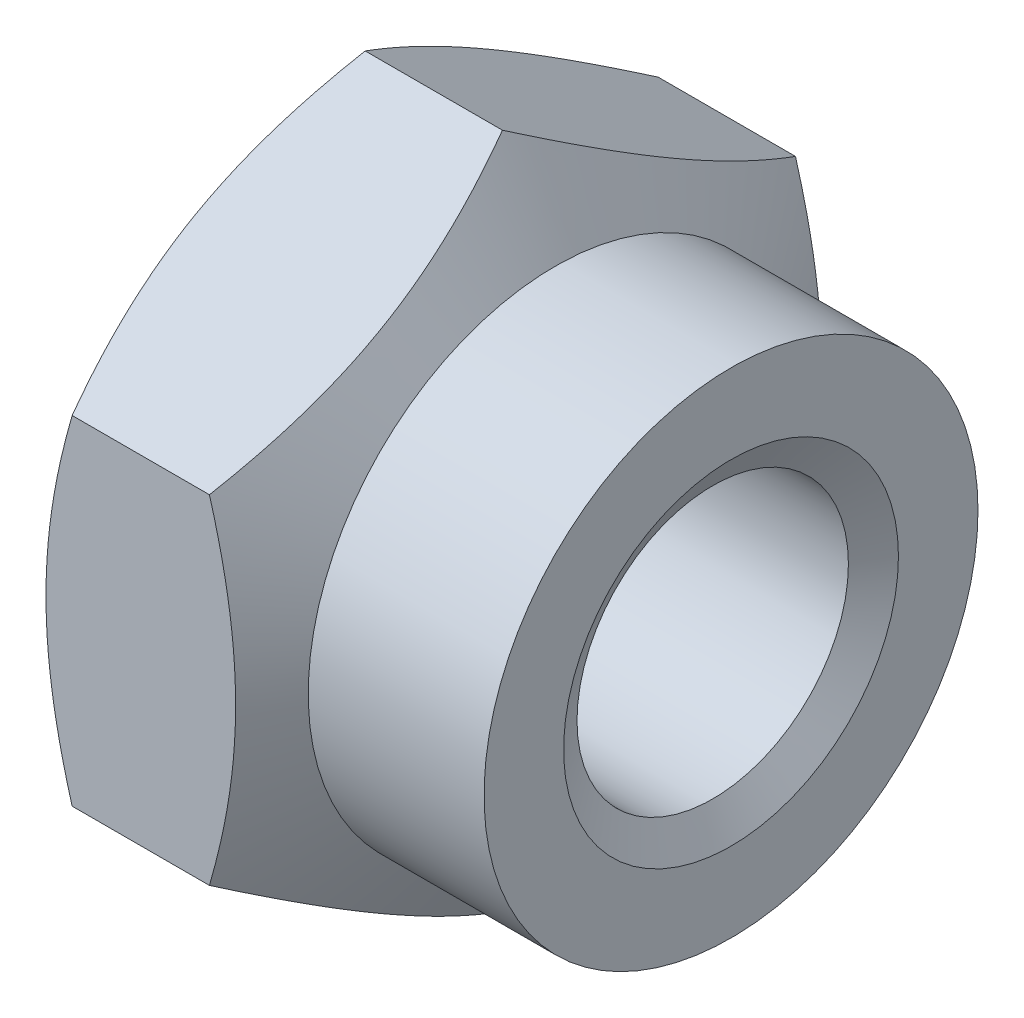
ISO-10303-21;
HEADER;
FILE_DESCRIPTION(('STEP AP214'),'2;1');
FILE_NAME('part.step','',(''),(''),'','','');
FILE_SCHEMA(('AUTOMOTIVE_DESIGN { 1 0 10303 214 1 1 1 1 }'));
ENDSEC;
DATA;
#1=APPLICATION_CONTEXT('core data for automotive mechanical design processes');
#2=APPLICATION_PROTOCOL_DEFINITION('international standard','automotive_design',2000,#1);
#3=PRODUCT_CONTEXT('',#1,'mechanical');
#4=PRODUCT('Part','Part','',(#3));
#5=PRODUCT_RELATED_PRODUCT_CATEGORY('part','',(#4));
#6=PRODUCT_DEFINITION_FORMATION('','',#4);
#7=PRODUCT_DEFINITION_CONTEXT('part definition',#1,'design');
#8=PRODUCT_DEFINITION('design','',#6,#7);
#9=PRODUCT_DEFINITION_SHAPE('','',#8);
#10=(LENGTH_UNIT() NAMED_UNIT(*) SI_UNIT(.MILLI.,.METRE.));
#11=(NAMED_UNIT(*) PLANE_ANGLE_UNIT() SI_UNIT($,.RADIAN.));
#12=(NAMED_UNIT(*) SI_UNIT($,.STERADIAN.) SOLID_ANGLE_UNIT());
#13=UNCERTAINTY_MEASURE_WITH_UNIT(LENGTH_MEASURE(1.E-05),#10,'distance_accuracy_value','');
#14=(GEOMETRIC_REPRESENTATION_CONTEXT(3) GLOBAL_UNCERTAINTY_ASSIGNED_CONTEXT((#13)) GLOBAL_UNIT_ASSIGNED_CONTEXT((#10,
#11,#12)) REPRESENTATION_CONTEXT('',''));
#15=CARTESIAN_POINT('',(0.,0.,0.));
#16=DIRECTION('',(0.,0.,1.));
#17=DIRECTION('',(1.,0.,0.));
#18=AXIS2_PLACEMENT_3D('',#15,#16,#17);
#19=CARTESIAN_POINT('',(0.,-2.02072594216369,-3.5));
#20=DIRECTION('',(0.,-0.866025403784438,-0.5));
#21=DIRECTION('',(0.,0.5,-0.866025403784438));
#22=AXIS2_PLACEMENT_3D('',#19,#20,#21);
#23=PLANE('',#22);
#24=CARTESIAN_POINT('',(0.630150014201649,-2.02072598546637,-3.49999992499622));
#25=CARTESIAN_POINT('',(0.578867220227142,-2.10952465193618,-3.346196123027));
#26=CARTESIAN_POINT('',(0.532228203362515,-2.19908982723308,-3.19106468882431));
#27=CARTESIAN_POINT('',(0.450821200915491,-2.37977093886553,-2.87811582350915));
#28=CARTESIAN_POINT('',(0.416082010900104,-2.47089008450928,-2.7202928337118));
#29=CARTESIAN_POINT('',(0.362007958096548,-2.65199918192389,-2.4066026752767));
#30=CARTESIAN_POINT('',(0.342313160538677,-2.74196127554762,-2.25078375836515));
#31=CARTESIAN_POINT('',(0.318806080923748,-2.92230854323823,-1.9384131277188));
#32=CARTESIAN_POINT('',(0.314974328300394,-3.01269306224179,-1.78186254858696));
#33=CARTESIAN_POINT('',(0.322966050013783,-3.18156683407466,-1.48936459570663));
#34=CARTESIAN_POINT('',(0.33282729178681,-3.26008142781289,-1.35337333021638));
#35=CARTESIAN_POINT('',(0.364075317786994,-3.41659911833186,-1.0822767379542));
#36=CARTESIAN_POINT('',(0.385472765827316,-3.49460167416391,-0.947172348132856));
#37=CARTESIAN_POINT('',(0.43896224349233,-3.65144180578213,-0.67551727150431));
#38=CARTESIAN_POINT('',(0.471280905686307,-3.73025954135081,-0.539000948961814));
#39=CARTESIAN_POINT('',(0.54463060530994,-3.88671978608905,-0.268003855710532));
#40=CARTESIAN_POINT('',(0.585644419546534,-3.96436429814832,-0.133519615894977));
#41=CARTESIAN_POINT('',(0.630150014199006,-4.04145184102031,-7.50100528599814E-08));
#42=B_SPLINE_CURVE_WITH_KNOTS('',3,(#24,#25,#26,#27,#28,#29,#30,#31,#32,#33,#34,#35,#36,#37,#38,
#39,#40,#41),.UNSPECIFIED.,.F.,.F.,(4,2,2,2,2,2,2,2,4),(0.,0.554778014293772,1.11088916777355,
1.65323829337992,2.19492153288442,2.66648855859081,3.13849223965251,3.62096269935922,
4.10248627343419),.UNSPECIFIED.);
#43=CARTESIAN_POINT('',(0.630150044012355,-2.02072595882601,-3.5));
#44=VERTEX_POINT('',#43);
#45=CARTESIAN_POINT('',(0.630150026700639,-4.04145186267377,-3.7505153091958E-08));
#46=VERTEX_POINT('',#45);
#47=EDGE_CURVE('E249',#44,#46,#42,.T.);
#48=ORIENTED_EDGE('',*,*,#47,.F.);
#49=DIRECTION('',(1.,0.,0.));
#50=VECTOR('',#49,1.);
#51=CARTESIAN_POINT('',(0.,-2.02072594216369,-3.5));
#52=LINE('',#51,#50);
#53=CARTESIAN_POINT('',(2.26984997330317,-2.02072596380483,-3.49999996251644));
#54=VERTEX_POINT('',#53);
#55=EDGE_CURVE('E96',#54,#44,#52,.F.);
#56=ORIENTED_EDGE('',*,*,#55,.F.);
#57=CARTESIAN_POINT('',(2.26984995118854,-4.04145190098989,2.88603183590748E-08));
#58=CARTESIAN_POINT('',(2.32113274799531,-3.95265323352798,-0.153803774828139));
#59=CARTESIAN_POINT('',(2.36777176787103,-3.86308805723251,-0.308935210760751));
#60=CARTESIAN_POINT('',(2.44917877657305,-3.6824069435057,-0.62188407970371));
#61=CARTESIAN_POINT('',(2.48391796982875,-3.59128779676555,-0.779707071399984));
#62=CARTESIAN_POINT('',(2.53799202905945,-3.41017869716019,-1.09339723362952));
#63=CARTESIAN_POINT('',(2.55768682981688,-3.32021660244603,-1.24921615242977));
#64=CARTESIAN_POINT('',(2.58119391560829,-3.13986933244696,-1.56158678707449));
#65=CARTESIAN_POINT('',(2.58502567121085,-3.04948481222562,-1.7181373683156));
#66=CARTESIAN_POINT('',(2.57703395444406,-2.88061103529859,-2.01063533001927));
#67=CARTESIAN_POINT('',(2.56717271428084,-2.80209643770439,-2.14662660218824));
#68=CARTESIAN_POINT('',(2.5359246902104,-2.64557873946101,-2.4177232078295));
#69=CARTESIAN_POINT('',(2.51452724248719,-2.5675761797606,-2.55282760435104));
#70=CARTESIAN_POINT('',(2.46103776426699,-2.41073604026809,-2.82448269461826));
#71=CARTESIAN_POINT('',(2.4287191011591,-2.33191830069638,-2.96099902409419));
#72=CARTESIAN_POINT('',(2.35536939875617,-2.17545804807543,-3.23199613099874));
#73=CARTESIAN_POINT('',(2.31435558265801,-2.09781353213604,-3.36648037753486));
#74=CARTESIAN_POINT('',(2.26984998579716,-2.02072598544507,-3.49999992503446));
#75=B_SPLINE_CURVE_WITH_KNOTS('',3,(#57,#58,#59,#60,#61,#62,#63,#64,#65,#66,#67,#68,#69,#70,#71,
#72,#73,#74),.UNSPECIFIED.,.F.,.F.,(4,2,2,2,2,2,2,2,4),(0.,0.554778022383838,1.11088918416299,
1.65323831731949,2.19492156429581,2.66648861271116,3.1384923165695,3.62096280030852,
4.10248639826226),.UNSPECIFIED.);
#76=CARTESIAN_POINT('',(2.26984997330875,-4.04145186267656,3.75003131262279E-08));
#77=VERTEX_POINT('',#76);
#78=EDGE_CURVE('E92',#77,#54,#75,.T.);
#79=ORIENTED_EDGE('',*,*,#78,.F.);
#80=DIRECTION('',(1.,0.,0.));
#81=VECTOR('',#80,1.);
#82=CARTESIAN_POINT('',(0.,-4.04145188432738,0.));
#83=LINE('',#82,#81);
#84=EDGE_CURVE('E80',#46,#77,#83,.T.);
#85=ORIENTED_EDGE('',*,*,#84,.F.);
#86=EDGE_LOOP('',(#48,#56,#79,#85));
#87=FACE_BOUND('',#86,.T.);
#88=ADVANCED_FACE('F17',(#87),#23,.T.);
#89=CARTESIAN_POINT('',(0.,-4.04145188432738,0.));
#90=DIRECTION('',(0.,-0.866025403784439,0.5));
#91=DIRECTION('',(0.,-0.5,-0.866025403784439));
#92=AXIS2_PLACEMENT_3D('',#89,#90,#91);
#93=PLANE('',#92);
#94=CARTESIAN_POINT('',(0.630150048824673,-4.04145190099372,-2.88669495236416E-08));
#95=CARTESIAN_POINT('',(0.578867252017729,-3.95265323353174,0.153803774821607));
#96=CARTESIAN_POINT('',(0.532228232141822,-3.86308805723622,0.308935210754318));
#97=CARTESIAN_POINT('',(0.450821223439403,-3.68240694350929,0.621884079697485));
#98=CARTESIAN_POINT('',(0.416082030183497,-3.59128779676908,0.779707071393866));
#99=CARTESIAN_POINT('',(0.362007970952379,-3.41017869716358,1.09339723362364));
#100=CARTESIAN_POINT('',(0.342313170194742,-3.32021660244934,1.24921615242402));
#101=CARTESIAN_POINT('',(0.318806084402937,-3.13986933245012,1.56158678706903));
#102=CARTESIAN_POINT('',(0.314974328800188,-3.04948481222869,1.71813736831028));
#103=CARTESIAN_POINT('',(0.32296604556658,-2.88061103530297,2.01063533001167));
#104=CARTESIAN_POINT('',(0.332827285729363,-2.80209643771017,2.14662660217822));
#105=CARTESIAN_POINT('',(0.364075309798546,-2.64557873946957,2.41772320781468));
#106=CARTESIAN_POINT('',(0.385472757520932,-2.56757617977053,2.55282760433385));
#107=CARTESIAN_POINT('',(0.438962235739174,-2.41073604028079,2.82448269459626));
#108=CARTESIAN_POINT('',(0.471280898845909,-2.33191830071048,2.96099902406977));
#109=CARTESIAN_POINT('',(0.54463060124633,-2.17545804809227,3.23199613096957));
#110=CARTESIAN_POINT('',(0.585644417343135,-2.09781353215423,3.36648037750335));
#111=CARTESIAN_POINT('',(0.630150014202574,-2.02072598546458,3.49999992500065));
#112=B_SPLINE_CURVE_WITH_KNOTS('',3,(#94,#95,#96,#97,#98,#99,#100,#101,#102,#103,#104,#105,#106,
#107,#108,#109,#110,#111),.UNSPECIFIED.,.F.,.F.,(4,2,2,2,2,2,2,2,4),(0.,0.554778022384315,
1.11088918416395,1.65323831732097,2.19492156429781,2.66648861270473,3.1384923165546,
3.62096280028471,4.10248639822961),.UNSPECIFIED.);
#113=CARTESIAN_POINT('',(0.630150026702465,-2.02072596381414,3.49999996250033));
#114=VERTEX_POINT('',#113);
#115=EDGE_CURVE('E83',#46,#114,#112,.T.);
#116=ORIENTED_EDGE('',*,*,#115,.F.);
#117=ORIENTED_EDGE('',*,*,#84,.T.);
#118=CARTESIAN_POINT('',(2.2698499858071,-2.02072598546323,3.4999999249959));
#119=CARTESIAN_POINT('',(2.32113277978282,-2.1095246519346,3.34619612302768));
#120=CARTESIAN_POINT('',(2.36777179664799,-2.19908982723219,3.19106468882531));
#121=CARTESIAN_POINT('',(2.44917879909549,-2.37977093886526,2.87811582351016));
#122=CARTESIAN_POINT('',(2.48391798911081,-2.47089008450895,2.72029283371253));
#123=CARTESIAN_POINT('',(2.53799204191436,-2.65199918192361,2.40660267527704));
#124=CARTESIAN_POINT('',(2.55768683947229,-2.74196127554746,2.25078375836539));
#125=CARTESIAN_POINT('',(2.58119391908727,-2.92230854323825,1.9384131277188));
#126=CARTESIAN_POINT('',(2.58502567171062,-3.01269306224188,1.78186254858682));
#127=CARTESIAN_POINT('',(2.57703394999718,-3.18156683407523,1.48936459570562));
#128=CARTESIAN_POINT('',(2.56717270822407,-3.26008142781389,1.35337333021466));
#129=CARTESIAN_POINT('',(2.53592468222358,-3.41659911833367,1.08227673795106));
#130=CARTESIAN_POINT('',(2.51452723418305,-3.49460167416613,0.947172348129011));
#131=CARTESIAN_POINT('',(2.46103775651751,-3.65144180578518,0.675517271499026));
#132=CARTESIAN_POINT('',(2.42871909432322,-3.73025954135429,0.539000948955796));
#133=CARTESIAN_POINT('',(2.35536939469889,-3.88671978609336,0.268003855703067));
#134=CARTESIAN_POINT('',(2.31435558046192,-3.96436429815304,0.133519615886799));
#135=CARTESIAN_POINT('',(2.26984998580904,-4.04145184102543,7.50011723129684E-08));
#136=B_SPLINE_CURVE_WITH_KNOTS('',3,(#118,#119,#120,#121,#122,#123,#124,#125,#126,#127,#128,
#129,#130,#131,#132,#133,#134,#135),.UNSPECIFIED.,.F.,.F.,(4,2,2,2,2,2,2,2,4),(0.,
0.554778014294406,1.11088916777477,1.65323829338158,2.19492153288656,2.66648855859544,
3.13849223965963,3.62096269936902,4.10248627344667),.UNSPECIFIED.);
#137=CARTESIAN_POINT('',(2.2698499559984,-2.02072595882687,3.5));
#138=VERTEX_POINT('',#137);
#139=EDGE_CURVE('E21',#138,#77,#136,.T.);
#140=ORIENTED_EDGE('',*,*,#139,.F.);
#141=DIRECTION('',(1.,0.,0.));
#142=VECTOR('',#141,1.);
#143=CARTESIAN_POINT('',(0.,-2.02072594216369,3.5));
#144=LINE('',#143,#142);
#145=EDGE_CURVE('E73',#114,#138,#144,.T.);
#146=ORIENTED_EDGE('',*,*,#145,.F.);
#147=EDGE_LOOP('',(#116,#117,#140,#146));
#148=FACE_BOUND('',#147,.T.);
#149=ADVANCED_FACE('F82',(#148),#93,.T.);
#150=CARTESIAN_POINT('',(0.,-2.02072594216369,3.5));
#151=DIRECTION('',(0.,0.,1.));
#152=DIRECTION('',(0.,-1.,0.));
#153=AXIS2_PLACEMENT_3D('',#150,#151,#152);
#154=PLANE('',#153);
#155=CARTESIAN_POINT('',(0.63015004882102,-2.02072597548372,3.5));
#156=CARTESIAN_POINT('',(0.578867252014371,-1.84312864055996,3.5));
#157=CARTESIAN_POINT('',(0.532228232138778,-1.66399828796911,3.5));
#158=CARTESIAN_POINT('',(0.450821223437014,-1.30263606051566,3.5));
#159=CARTESIAN_POINT('',(0.416082030181448,-1.12039776703544,3.5));
#160=CARTESIAN_POINT('',(0.362007970951013,-0.758179567824902,3.5));
#161=CARTESIAN_POINT('',(0.342313170193717,-0.578255378396678,3.5));
#162=CARTESIAN_POINT('',(0.318806084402569,-0.217560838398744,3.5));
#163=CARTESIAN_POINT('',(0.314974328800135,-0.03679179795616,3.5));
#164=CARTESIAN_POINT('',(0.322966045567141,0.300955755898064,3.5));
#165=CARTESIAN_POINT('',(0.332827285730491,0.45798495108673,3.5));
#166=CARTESIAN_POINT('',(0.364075309801218,0.771020347574003,3.5));
#167=CARTESIAN_POINT('',(0.385472757524582,0.927025466975086,3.5));
#168=CARTESIAN_POINT('',(0.438962235745121,1.24070574596062,3.5));
#169=CARTESIAN_POINT('',(0.471280898853187,1.39834122510429,3.5));
#170=CARTESIAN_POINT('',(0.544630601256481,1.71126173034671,3.5));
#171=CARTESIAN_POINT('',(0.585644417354826,1.86655076222574,3.5));
#172=CARTESIAN_POINT('',(0.630150014215858,2.02072585560792,3.5));
#173=B_SPLINE_CURVE_WITH_KNOTS('',3,(#155,#156,#157,#158,#159,#160,#161,#162,#163,#164,#165,
#166,#167,#168,#169,#170,#171,#172),.UNSPECIFIED.,.F.,.F.,(4,2,2,2,2,2,2,2,4),(0.,
0.554778022383508,1.11088918416232,1.6532383173185,2.1949215642945,2.66648861271067,
3.13849231656984,3.62096280030973,4.10248639826432),.UNSPECIFIED.);
#174=CARTESIAN_POINT('',(0.630150026708842,2.02072589888489,3.5));
#175=VERTEX_POINT('',#174);
#176=EDGE_CURVE('E163',#114,#175,#173,.T.);
#177=ORIENTED_EDGE('',*,*,#176,.F.);
#178=ORIENTED_EDGE('',*,*,#145,.T.);
#179=CARTESIAN_POINT('',(2.26984995118682,2.02072597549467,3.5));
#180=CARTESIAN_POINT('',(2.32113274800484,1.84312864053177,3.5));
#181=CARTESIAN_POINT('',(2.36777176788994,1.6639982879013,3.5));
#182=CARTESIAN_POINT('',(2.44917877660607,1.30263606036243,3.5));
#183=CARTESIAN_POINT('',(2.48391796986615,1.12039776683632,3.5));
#184=CARTESIAN_POINT('',(2.53799202908412,0.758179567618496,3.5));
#185=CARTESIAN_POINT('',(2.55768682983131,0.578255378229937,3.5));
#186=CARTESIAN_POINT('',(2.58119391561052,0.217560838318533,3.5));
#187=CARTESIAN_POINT('',(2.58502567121146,0.0367917979228319,3.5));
#188=CARTESIAN_POINT('',(2.57703395420329,-0.300955766014669,3.5));
#189=CARTESIAN_POINT('',(2.56717271300591,-0.457984971311765,3.5));
#190=CARTESIAN_POINT('',(2.53592468544421,-0.771020387847949,3.5));
#191=CARTESIAN_POINT('',(2.51452723526053,-0.927025517189113,3.5));
#192=CARTESIAN_POINT('',(2.46103775090524,-1.2407058162849,3.5));
#193=CARTESIAN_POINT('',(2.42871908407828,-1.39834130558888,3.5));
#194=CARTESIAN_POINT('',(2.35536937342834,-1.71126183078223,3.5));
#195=CARTESIAN_POINT('',(2.31435555280717,-1.86655087245322,3.5));
#196=CARTESIAN_POINT('',(2.26984995118815,-2.02072597549006,3.5));
#197=B_SPLINE_CURVE_WITH_KNOTS('',3,(#179,#180,#181,#182,#183,#184,#185,#186,#187,#188,#189,
#190,#191,#192,#193,#194,#195,#196),.UNSPECIFIED.,.F.,.F.,(4,2,2,2,2,2,2,2,4),(0.,
0.55477802250554,1.11088918442198,1.65323831745545,2.19492156429743,2.66648864308187,
3.13849237742165,3.62096289322499,4.10248652299892),.UNSPECIFIED.);
#198=CARTESIAN_POINT('',(2.26984997330961,2.02072596381599,3.49999996249711));
#199=VERTEX_POINT('',#198);
#200=EDGE_CURVE('E94',#199,#138,#197,.T.);
#201=ORIENTED_EDGE('',*,*,#200,.F.);
#202=DIRECTION('',(1.,0.,0.));
#203=VECTOR('',#202,1.);
#204=CARTESIAN_POINT('',(0.,2.02072594216369,3.5));
#205=LINE('',#204,#203);
#206=EDGE_CURVE('E232',#175,#199,#205,.T.);
#207=ORIENTED_EDGE('',*,*,#206,.F.);
#208=EDGE_LOOP('',(#177,#178,#201,#207));
#209=FACE_BOUND('',#208,.T.);
#210=ADVANCED_FACE('F171',(#209),#154,.T.);
#211=CARTESIAN_POINT('',(0.,2.02072594216369,3.5));
#212=DIRECTION('',(0.,0.866025403784439,0.5));
#213=DIRECTION('',(0.,-0.5,0.866025403784439));
#214=AXIS2_PLACEMENT_3D('',#211,#212,#213);
#215=PLANE('',#214);
#216=CARTESIAN_POINT('',(0.630150048823882,2.02072592549872,3.50000002886458));
#217=CARTESIAN_POINT('',(0.578867252016999,2.10952459296068,3.34619622517605));
#218=CARTESIAN_POINT('',(0.532228232141157,2.19908976925619,3.19106478924336));
#219=CARTESIAN_POINT('',(0.450821223438875,2.37977088298308,2.87811592030025));
#220=CARTESIAN_POINT('',(0.416082030183042,2.47089002972329,2.7202929286039));
#221=CARTESIAN_POINT('',(0.362007970952075,2.65199912932874,2.4066027663742));
#222=CARTESIAN_POINT('',(0.342313170194515,2.74196122404294,2.25078384757388));
#223=CARTESIAN_POINT('',(0.318806084402857,2.9223084940421,1.938413212929));
#224=CARTESIAN_POINT('',(0.314974328800176,3.01269301426349,1.78186263168781));
#225=CARTESIAN_POINT('',(0.322966045566777,3.18156679119109,1.48936466998316));
#226=CARTESIAN_POINT('',(0.332827285730006,3.2600813887858,1.35337339781329));
#227=CARTESIAN_POINT('',(0.364075309800618,3.4165990870302,1.08227679217025));
#228=CARTESIAN_POINT('',(0.385472757523987,3.49460164673113,0.947172395647822));
#229=CARTESIAN_POINT('',(0.438962235744649,3.65144178622467,0.675517305378809));
#230=CARTESIAN_POINT('',(0.471280898852838,3.7302595257969,0.539000975901973));
#231=CARTESIAN_POINT('',(0.544630601256465,3.88671977841889,0.268003868995635));
#232=CARTESIAN_POINT('',(0.585644417355021,3.96436429435879,0.133519622458641));
#233=CARTESIAN_POINT('',(0.630150014216296,4.04145184105025,7.49581789627771E-08));
#234=B_SPLINE_CURVE_WITH_KNOTS('',3,(#216,#217,#218,#219,#220,#221,#222,#223,#224,#225,#226,
#227,#228,#229,#230,#231,#232,#233),.UNSPECIFIED.,.F.,.F.,(4,2,2,2,2,2,2,2,4),(0.,
0.554778022384179,1.11088918416368,1.65323831732048,2.1949215642971,2.66648861271553,
3.13849231657697,3.62096280031925,4.10248639827622),.UNSPECIFIED.);
#235=CARTESIAN_POINT('',(0.630150026709073,4.04145186268838,3.7479850701366E-08));
#236=VERTEX_POINT('',#235);
#237=EDGE_CURVE('E154',#175,#236,#234,.T.);
#238=ORIENTED_EDGE('',*,*,#237,.F.);
#239=ORIENTED_EDGE('',*,*,#206,.T.);
#240=CARTESIAN_POINT('',(2.26984995118295,4.04145190099957,-2.88770871665031E-08));
#241=CARTESIAN_POINT('',(2.32113274799017,3.9526532335375,0.153803774811635));
#242=CARTESIAN_POINT('',(2.36777176786637,3.86308805724188,0.308935210744513));
#243=CARTESIAN_POINT('',(2.4491787765694,3.68240694351475,0.621884079688029));
#244=CARTESIAN_POINT('',(2.48391796982562,3.59128779677443,0.779707071384593));
#245=CARTESIAN_POINT('',(2.53799202905737,3.41017869716872,1.09339723361474));
#246=CARTESIAN_POINT('',(2.55768682981532,3.32021660245437,1.24921615241531));
#247=CARTESIAN_POINT('',(2.58119391560773,3.13986933245492,1.5615867870607));
#248=CARTESIAN_POINT('',(2.58502567121077,3.04948481223337,1.71813736830217));
#249=CARTESIAN_POINT('',(2.57703395444488,2.88061103530748,2.01063533000385));
#250=CARTESIAN_POINT('',(2.56717271428232,2.80209643771464,2.14662660217049));
#251=CARTESIAN_POINT('',(2.53592469021355,2.64557873947393,2.41772320780713));
#252=CARTESIAN_POINT('',(2.51452724249135,2.56757617977483,2.55282760432639));
#253=CARTESIAN_POINT('',(2.46103776427345,2.41073604028497,2.82448269458901));
#254=CARTESIAN_POINT('',(2.42871910116687,2.33191830071461,2.96099902406262));
#255=CARTESIAN_POINT('',(2.35536939876671,2.17545804809627,3.23199613096264));
#256=CARTESIAN_POINT('',(2.31435558267002,2.09781353215817,3.36648037749653));
#257=CARTESIAN_POINT('',(2.26984998581067,2.02072598546847,3.49999992499393));
#258=B_SPLINE_CURVE_WITH_KNOTS('',3,(#240,#241,#242,#243,#244,#245,#246,#247,#248,#249,#250,
#251,#252,#253,#254,#255,#256,#257),.UNSPECIFIED.,.F.,.F.,(4,2,2,2,2,2,2,2,4),(0.,
0.554778022385097,1.11088918416554,1.6532383173233,2.19492156430088,2.66648861270804,
3.13849231655816,3.62096280028854,4.10248639823371),.UNSPECIFIED.);
#259=CARTESIAN_POINT('',(2.26984997330374,4.04145186268525,-3.748527405546E-08));
#260=VERTEX_POINT('',#259);
#261=EDGE_CURVE('E131',#260,#199,#258,.T.);
#262=ORIENTED_EDGE('',*,*,#261,.F.);
#263=DIRECTION('',(1.,0.,0.));
#264=VECTOR('',#263,1.);
#265=CARTESIAN_POINT('',(0.,4.04145188432738,0.));
#266=LINE('',#265,#264);
#267=EDGE_CURVE('E234',#236,#260,#266,.T.);
#268=ORIENTED_EDGE('',*,*,#267,.F.);
#269=EDGE_LOOP('',(#238,#239,#262,#268));
#270=FACE_BOUND('',#269,.T.);
#271=ADVANCED_FACE('F143',(#270),#215,.T.);
#272=CARTESIAN_POINT('',(0.,4.04145188432738,0.));
#273=DIRECTION('',(0.,0.866025403784439,-0.5));
#274=DIRECTION('',(0.,0.5,0.866025403784439));
#275=AXIS2_PLACEMENT_3D('',#272,#273,#274);
#276=PLANE('',#275);
#277=CARTESIAN_POINT('',(0.630150048823421,4.04145190099155,2.88631926491844E-08));
#278=CARTESIAN_POINT('',(0.578867252016577,3.95265323352961,-0.15380377482531));
#279=CARTESIAN_POINT('',(0.532228232140777,3.86308805723412,-0.308935210757967));
#280=CARTESIAN_POINT('',(0.450821223438581,3.68240694350726,-0.621884079701019));
#281=CARTESIAN_POINT('',(0.416082030182791,3.59128779676707,-0.77970707139734));
#282=CARTESIAN_POINT('',(0.362007970951908,3.41017869716165,-1.09339723362698));
#283=CARTESIAN_POINT('',(0.342313170194389,3.32021660244746,-1.24921615242728));
#284=CARTESIAN_POINT('',(0.318806084402811,3.13986933244833,-1.56158678707213));
#285=CARTESIAN_POINT('',(0.31497432880017,3.04948481222695,-1.71813736831329));
#286=CARTESIAN_POINT('',(0.322966045566796,2.88061103530026,-2.01063533001636));
#287=CARTESIAN_POINT('',(0.332827285729874,2.80209643770645,-2.14662660218467));
#288=CARTESIAN_POINT('',(0.364075309799926,2.64557873946383,-2.41772320782462));
#289=CARTESIAN_POINT('',(0.385472757522885,2.56757617976379,-2.55282760434551));
#290=CARTESIAN_POINT('',(0.43896223574251,2.41073604027204,-2.82448269461142));
#291=CARTESIAN_POINT('',(0.471280898850062,2.33191830070072,-2.96099902408668));
#292=CARTESIAN_POINT('',(0.544630601252268,2.17545804808051,-3.23199613098994));
#293=CARTESIAN_POINT('',(0.58564441735004,2.09781353214149,-3.36648037752542));
#294=CARTESIAN_POINT('',(0.630150014210487,2.02072598545088,-3.49999992502439));
#295=B_SPLINE_CURVE_WITH_KNOTS('',3,(#277,#278,#279,#280,#281,#282,#283,#284,#285,#286,#287,
#288,#289,#290,#291,#292,#293,#294),.UNSPECIFIED.,.F.,.F.,(4,2,2,2,2,2,2,2,4),(0.,
0.554778022384051,1.11088918416342,1.65323831732014,2.19492156429668,2.66648861270971,
3.13849231656573,3.6209628003023,4.10248639825361),.UNSPECIFIED.);
#296=CARTESIAN_POINT('',(0.630150026706016,2.02072596380799,-3.49999996251098));
#297=VERTEX_POINT('',#296);
#298=EDGE_CURVE('E40',#236,#297,#295,.T.);
#299=ORIENTED_EDGE('',*,*,#298,.F.);
#300=ORIENTED_EDGE('',*,*,#267,.T.);
#301=CARTESIAN_POINT('',(2.26984995118868,2.02072592550142,-3.5000000288599));
#302=CARTESIAN_POINT('',(2.32113274799544,2.10952459296333,-3.34619622517145));
#303=CARTESIAN_POINT('',(2.36777176787114,2.1990897692588,-3.19106478923885));
#304=CARTESIAN_POINT('',(2.44917877657314,2.37977088298559,-2.87811592029591));
#305=CARTESIAN_POINT('',(2.48391796982883,2.47089002972574,-2.72029292859964));
#306=CARTESIAN_POINT('',(2.53799202905951,2.6519991293311,-2.40660276637012));
#307=CARTESIAN_POINT('',(2.55768682981692,2.74196122404525,-2.25078384756988));
#308=CARTESIAN_POINT('',(2.5811939156083,2.92230849404431,-1.93841321292517));
#309=CARTESIAN_POINT('',(2.58502567121085,3.01269301426565,-1.78186263168407));
#310=CARTESIAN_POINT('',(2.57703395444405,3.1815667911925,-1.48936466998071));
#311=CARTESIAN_POINT('',(2.56717271428086,3.26008138878652,-1.35337339781203));
#312=CARTESIAN_POINT('',(2.53592469021051,3.41659908702955,-1.08227679217137));
#313=CARTESIAN_POINT('',(2.51452724248738,3.49460164672979,-0.947172395650132));
#314=CARTESIAN_POINT('',(2.46103776426737,3.65144178622196,-0.675517305383515));
#315=CARTESIAN_POINT('',(2.42871910115961,3.73025952579349,-0.539000975907891));
#316=CARTESIAN_POINT('',(2.35536939875695,3.8867197784141,-0.268003869003935));
#317=CARTESIAN_POINT('',(2.31435558265894,3.96436429435332,-0.133519622468111));
#318=CARTESIAN_POINT('',(2.26984998579825,4.04145184104412,-7.49688032522905E-08));
#319=B_SPLINE_CURVE_WITH_KNOTS('',3,(#301,#302,#303,#304,#305,#306,#307,#308,#309,#310,#311,
#312,#313,#314,#315,#316,#317,#318),.UNSPECIFIED.,.F.,.F.,(4,2,2,2,2,2,2,2,4),(0.,
0.554778022383802,1.11088918416292,1.65323831731939,2.19492156429568,2.66648861270999,
3.13849231656728,3.6209628003052,4.10248639825784),.UNSPECIFIED.);
#320=CARTESIAN_POINT('',(2.26984997330478,2.02072589887582,-3.5));
#321=VERTEX_POINT('',#320);
#322=EDGE_CURVE('E99',#321,#260,#319,.T.);
#323=ORIENTED_EDGE('',*,*,#322,.F.);
#324=DIRECTION('',(1.,0.,0.));
#325=VECTOR('',#324,1.);
#326=CARTESIAN_POINT('',(0.,2.02072594216369,-3.5));
#327=LINE('',#326,#325);
#328=EDGE_CURVE('E95',#297,#321,#327,.T.);
#329=ORIENTED_EDGE('',*,*,#328,.F.);
#330=EDGE_LOOP('',(#299,#300,#323,#329));
#331=FACE_BOUND('',#330,.T.);
#332=ADVANCED_FACE('F140',(#331),#276,.T.);
#333=CARTESIAN_POINT('',(0.,2.02072594216369,-3.5));
#334=DIRECTION('',(0.,0.,-1.));
#335=DIRECTION('',(0.,1.,0.));
#336=AXIS2_PLACEMENT_3D('',#333,#334,#335);
#337=PLANE('',#336);
#338=CARTESIAN_POINT('',(0.630150048829535,2.02072597551322,-3.5));
#339=CARTESIAN_POINT('',(0.578867252011084,1.84312864055002,-3.5));
#340=CARTESIAN_POINT('',(0.532228232125513,1.66399828791924,-3.5));
#341=CARTESIAN_POINT('',(0.450821223408416,1.30263606037971,-3.5));
#342=CARTESIAN_POINT('',(0.416082030147842,1.12039776685327,-3.5));
#343=CARTESIAN_POINT('',(0.362007970928869,0.758179567634768,-3.5));
#344=CARTESIAN_POINT('',(0.342313170181191,0.578255378245871,-3.5));
#345=CARTESIAN_POINT('',(0.318806084401022,0.217560838333751,-3.5));
#346=CARTESIAN_POINT('',(0.314974328799624,0.0367917979376728,-3.5));
#347=CARTESIAN_POINT('',(0.322966045807026,-0.300955766001257,-3.5));
#348=CARTESIAN_POINT('',(0.332827287004145,-0.457984971299401,-3.5));
#349=CARTESIAN_POINT('',(0.364075314565494,-0.771020387837684,-3.5));
#350=CARTESIAN_POINT('',(0.385472764749082,-0.927025517179901,-3.5));
#351=CARTESIAN_POINT('',(0.438962249104377,-1.24070581627784,-3.5));
#352=CARTESIAN_POINT('',(0.47128091593142,-1.3983413055829,-3.5));
#353=CARTESIAN_POINT('',(0.544630626581668,-1.7112618307784,-3.5));
#354=CARTESIAN_POINT('',(0.585644447203069,-1.86655087245045,-3.5));
#355=CARTESIAN_POINT('',(0.630150048822352,-2.02072597548833,-3.5));
#356=B_SPLINE_CURVE_WITH_KNOTS('',3,(#338,#339,#340,#341,#342,#343,#344,#345,#346,#347,#348,
#349,#350,#351,#352,#353,#354,#355),.UNSPECIFIED.,.F.,.F.,(4,2,2,2,2,2,2,2,4),(0.,
0.554778022506789,1.11088918442451,1.65323831745915,2.19492156430229,2.6664886430898,
3.13849237743266,3.62096289323926,4.10248652301642),.UNSPECIFIED.);
#357=EDGE_CURVE('E153',#297,#44,#356,.T.);
#358=ORIENTED_EDGE('',*,*,#357,.F.);
#359=ORIENTED_EDGE('',*,*,#328,.T.);
#360=CARTESIAN_POINT('',(2.2698499511841,-2.02072597550412,-3.5));
#361=CARTESIAN_POINT('',(2.32113274799123,-1.84312864058003,-3.5));
#362=CARTESIAN_POINT('',(2.36777176786733,-1.66399828798884,-3.5));
#363=CARTESIAN_POINT('',(2.44917877657015,-1.3026360605347,-3.5));
#364=CARTESIAN_POINT('',(2.48391796982627,-1.12039776705411,-3.5));
#365=CARTESIAN_POINT('',(2.5379920290578,-0.758179567842828,-3.5));
#366=CARTESIAN_POINT('',(2.55768682981564,-0.578255378414226,-3.5));
#367=CARTESIAN_POINT('',(2.58119391560784,-0.217560838415492,-3.5));
#368=CARTESIAN_POINT('',(2.58502567121078,-0.0367917979724864,-3.5));
#369=CARTESIAN_POINT('',(2.57703395444466,0.300955755881807,-3.5));
#370=CARTESIAN_POINT('',(2.56717271428175,0.457984951070116,-3.5));
#371=CARTESIAN_POINT('',(2.53592469021193,0.771020347556707,-3.5));
#372=CARTESIAN_POINT('',(2.51452724248903,0.927025466957466,-3.5));
#373=CARTESIAN_POINT('',(2.46103776426941,1.24070574594236,-3.5));
#374=CARTESIAN_POINT('',(2.4287191011618,1.39834122508572,-3.5));
#375=CARTESIAN_POINT('',(2.35536939875939,1.71126173032752,-3.5));
#376=CARTESIAN_POINT('',(2.31435558266148,1.86655076220625,-3.5));
#377=CARTESIAN_POINT('',(2.26984998580086,2.02072585558814,-3.5));
#378=B_SPLINE_CURVE_WITH_KNOTS('',3,(#360,#361,#362,#363,#364,#365,#366,#367,#368,#369,#370,
#371,#372,#373,#374,#375,#376,#377),.UNSPECIFIED.,.F.,.F.,(4,2,2,2,2,2,2,2,4),(0.,
0.554778022384865,1.11088918416507,1.65323831732255,2.19492156429984,2.66648861271487,
3.13849231657288,3.62096280031156,4.10248639826497),.UNSPECIFIED.);
#379=EDGE_CURVE('E98',#54,#321,#378,.T.);
#380=ORIENTED_EDGE('',*,*,#379,.F.);
#381=ORIENTED_EDGE('',*,*,#55,.T.);
#382=EDGE_LOOP('',(#358,#359,#380,#381));
#383=FACE_BOUND('',#382,.T.);
#384=ADVANCED_FACE('F113',(#383),#337,.T.);
#385=CARTESIAN_POINT('',(2.26606906068128,0.,0.));
#386=DIRECTION('',(-1.,0.,0.));
#387=DIRECTION('',(0.,0.,1.));
#388=AXIS2_PLACEMENT_3D('',#385,#386,#387);
#389=CONICAL_SURFACE('',#388,4.04800059544641,1.04719755120157);
#390=CARTESIAN_POINT('',(2.9,0.,0.));
#391=DIRECTION('',(1.,0.,0.));
#392=DIRECTION('',(0.,0.,-1.));
#393=AXIS2_PLACEMENT_3D('',#390,#391,#392);
#394=CIRCLE('',#393,2.95);
#395=CARTESIAN_POINT('',(2.9,0.,-2.95));
#396=VERTEX_POINT('',#395);
#397=EDGE_CURVE('E216',#396,#396,#394,.T.);
#398=ORIENTED_EDGE('',*,*,#397,.F.);
#399=EDGE_LOOP('',(#398));
#400=FACE_BOUND('',#399,.T.);
#401=ORIENTED_EDGE('',*,*,#261,.T.);
#402=ORIENTED_EDGE('',*,*,#200,.T.);
#403=ORIENTED_EDGE('',*,*,#139,.T.);
#404=ORIENTED_EDGE('',*,*,#78,.T.);
#405=ORIENTED_EDGE('',*,*,#379,.T.);
#406=ORIENTED_EDGE('',*,*,#322,.T.);
#407=EDGE_LOOP('',(#401,#402,#403,#404,#405,#406));
#408=FACE_BOUND('',#407,.T.);
#409=ADVANCED_FACE('F90',(#400,#408),#389,.T.);
#410=CARTESIAN_POINT('',(0.63393093932973,0.,0.));
#411=DIRECTION('',(1.,0.,0.));
#412=DIRECTION('',(0.,0.,-1.));
#413=AXIS2_PLACEMENT_3D('',#410,#411,#412);
#414=CONICAL_SURFACE('',#413,4.04800059544641,1.04719755120157);
#415=CARTESIAN_POINT('',(1.75873855409736E-11,0.,0.));
#416=DIRECTION('',(1.,0.,0.));
#417=DIRECTION('',(0.,0.,-1.));
#418=AXIS2_PLACEMENT_3D('',#415,#416,#417);
#419=CIRCLE('',#418,2.9500000000553);
#420=CARTESIAN_POINT('',(1.75873855409736E-11,0.,-2.9500000000553));
#421=VERTEX_POINT('',#420);
#422=EDGE_CURVE('E222',#421,#421,#419,.T.);
#423=ORIENTED_EDGE('',*,*,#422,.T.);
#424=EDGE_LOOP('',(#423));
#425=FACE_BOUND('',#424,.T.);
#426=ORIENTED_EDGE('',*,*,#298,.T.);
#427=ORIENTED_EDGE('',*,*,#357,.T.);
#428=ORIENTED_EDGE('',*,*,#47,.T.);
#429=ORIENTED_EDGE('',*,*,#115,.T.);
#430=ORIENTED_EDGE('',*,*,#176,.T.);
#431=ORIENTED_EDGE('',*,*,#237,.T.);
#432=EDGE_LOOP('',(#426,#427,#428,#429,#430,#431));
#433=FACE_BOUND('',#432,.T.);
#434=ADVANCED_FACE('F112',(#425,#433),#414,.T.);
#435=CARTESIAN_POINT('',(2.9,0.,0.));
#436=DIRECTION('',(1.,0.,0.));
#437=DIRECTION('',(0.,0.,-1.));
#438=AXIS2_PLACEMENT_3D('',#435,#436,#437);
#439=CYLINDRICAL_SURFACE('',#438,2.95);
#440=ORIENTED_EDGE('',*,*,#397,.T.);
#441=EDGE_LOOP('',(#440));
#442=FACE_BOUND('',#441,.T.);
#443=CARTESIAN_POINT('',(5.,0.,0.));
#444=DIRECTION('',(1.,0.,0.));
#445=DIRECTION('',(0.,0.,-1.));
#446=AXIS2_PLACEMENT_3D('',#443,#444,#445);
#447=CIRCLE('',#446,2.95);
#448=CARTESIAN_POINT('',(5.,0.,-2.95));
#449=VERTEX_POINT('',#448);
#450=EDGE_CURVE('E219',#449,#449,#447,.F.);
#451=ORIENTED_EDGE('',*,*,#450,.T.);
#452=EDGE_LOOP('',(#451));
#453=FACE_BOUND('',#452,.T.);
#454=ADVANCED_FACE('F205',(#442,#453),#439,.T.);
#455=CARTESIAN_POINT('',(0.,0.,0.));
#456=DIRECTION('',(1.,0.,0.));
#457=DIRECTION('',(0.,0.,-1.));
#458=AXIS2_PLACEMENT_3D('',#455,#456,#457);
#459=PLANE('',#458);
#460=CARTESIAN_POINT('',(0.,0.,0.));
#461=DIRECTION('',(-1.,0.,0.));
#462=DIRECTION('',(0.,0.,1.));
#463=AXIS2_PLACEMENT_3D('',#460,#461,#462);
#464=CIRCLE('',#463,1.99988611410618);
#465=CARTESIAN_POINT('',(0.,0.,1.99988611410618));
#466=VERTEX_POINT('',#465);
#467=EDGE_CURVE('E221',#466,#466,#464,.F.);
#468=ORIENTED_EDGE('',*,*,#467,.T.);
#469=EDGE_LOOP('',(#468));
#470=FACE_BOUND('',#469,.T.);
#471=ORIENTED_EDGE('',*,*,#422,.F.);
#472=EDGE_LOOP('',(#471));
#473=FACE_BOUND('',#472,.T.);
#474=ADVANCED_FACE('F202',(#470,#473),#459,.F.);
#475=CARTESIAN_POINT('',(5.,0.,0.));
#476=DIRECTION('',(-1.,0.,0.));
#477=DIRECTION('',(0.,0.,1.));
#478=AXIS2_PLACEMENT_3D('',#475,#476,#477);
#479=PLANE('',#478);
#480=CARTESIAN_POINT('',(4.99999999999545,0.,0.));
#481=DIRECTION('',(1.,0.,0.));
#482=DIRECTION('',(0.,0.,-1.));
#483=AXIS2_PLACEMENT_3D('',#480,#481,#482);
#484=CIRCLE('',#483,1.99988611421986);
#485=CARTESIAN_POINT('',(4.99999999999545,0.,-1.99988611421986));
#486=VERTEX_POINT('',#485);
#487=EDGE_CURVE('E225',#486,#486,#484,.F.);
#488=ORIENTED_EDGE('',*,*,#487,.T.);
#489=EDGE_LOOP('',(#488));
#490=FACE_BOUND('',#489,.T.);
#491=ORIENTED_EDGE('',*,*,#450,.F.);
#492=EDGE_LOOP('',(#491));
#493=FACE_BOUND('',#492,.T.);
#494=ADVANCED_FACE('F198',(#490,#493),#479,.F.);
#495=CARTESIAN_POINT('',(0.,0.,0.));
#496=DIRECTION('',(-1.,0.,0.));
#497=DIRECTION('',(0.,0.,1.));
#498=AXIS2_PLACEMENT_3D('',#495,#496,#497);
#499=CONICAL_SURFACE('',#498,1.99988611410618,1.0471975511642);
#500=ORIENTED_EDGE('',*,*,#467,.F.);
#501=EDGE_LOOP('',(#500));
#502=FACE_BOUND('',#501,.T.);
#503=CARTESIAN_POINT('',(0.21875,0.,0.));
#504=DIRECTION('',(-1.,0.,0.));
#505=DIRECTION('',(0.,0.,1.));
#506=AXIS2_PLACEMENT_3D('',#503,#504,#505);
#507=CIRCLE('',#506,1.621);
#508=CARTESIAN_POINT('',(0.21875,0.,1.621));
#509=VERTEX_POINT('',#508);
#510=EDGE_CURVE('E31',#509,#509,#507,.F.);
#511=ORIENTED_EDGE('',*,*,#510,.T.);
#512=EDGE_LOOP('',(#511));
#513=FACE_BOUND('',#512,.T.);
#514=ADVANCED_FACE('F190',(#502,#513),#499,.F.);
#515=CARTESIAN_POINT('',(4.99999999999545,0.,0.));
#516=DIRECTION('',(1.,0.,0.));
#517=DIRECTION('',(0.,0.,-1.));
#518=AXIS2_PLACEMENT_3D('',#515,#516,#517);
#519=CONICAL_SURFACE('',#518,1.99988611421986,1.04719755118161);
#520=ORIENTED_EDGE('',*,*,#487,.F.);
#521=EDGE_LOOP('',(#520));
#522=FACE_BOUND('',#521,.T.);
#523=CARTESIAN_POINT('',(4.78125,0.,0.));
#524=DIRECTION('',(-1.,0.,0.));
#525=DIRECTION('',(0.,0.,1.));
#526=AXIS2_PLACEMENT_3D('',#523,#524,#525);
#527=CIRCLE('',#526,1.621);
#528=CARTESIAN_POINT('',(4.78125,0.,1.621));
#529=VERTEX_POINT('',#528);
#530=EDGE_CURVE('E11',#529,#529,#527,.T.);
#531=ORIENTED_EDGE('',*,*,#530,.T.);
#532=EDGE_LOOP('',(#531));
#533=FACE_BOUND('',#532,.T.);
#534=ADVANCED_FACE('F184',(#522,#533),#519,.F.);
#535=CARTESIAN_POINT('',(11.8039541397505,0.,0.));
#536=DIRECTION('',(-1.,0.,0.));
#537=DIRECTION('',(0.,0.,1.));
#538=AXIS2_PLACEMENT_3D('',#535,#536,#537);
#539=CYLINDRICAL_SURFACE('',#538,1.621);
#540=ORIENTED_EDGE('',*,*,#530,.F.);
#541=EDGE_LOOP('',(#540));
#542=FACE_BOUND('',#541,.T.);
#543=ORIENTED_EDGE('',*,*,#510,.F.);
#544=EDGE_LOOP('',(#543));
#545=FACE_BOUND('',#544,.T.);
#546=ADVANCED_FACE('F182',(#542,#545),#539,.F.);
#547=CLOSED_SHELL('',(#88,#149,#210,#271,#332,#384,#409,#434,#454,#474,#494,#514,#534,#546));
#548=MANIFOLD_SOLID_BREP('B1',#547);
#549=ADVANCED_BREP_SHAPE_REPRESENTATION('',(#18,#548),#14);
#550=SHAPE_DEFINITION_REPRESENTATION(#9,#549);
ENDSEC;
END-ISO-10303-21;
